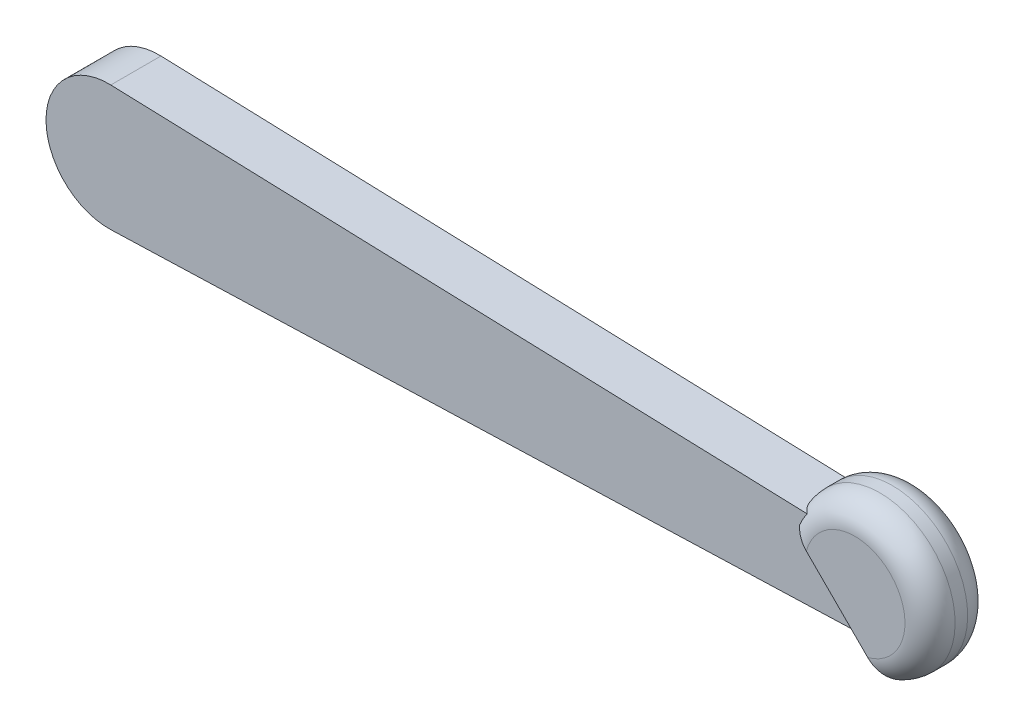
ISO-10303-21;
HEADER;
FILE_DESCRIPTION(('STEP AP214'),'2;1');
FILE_NAME('part.step','',(''),(''),'','','');
FILE_SCHEMA(('AUTOMOTIVE_DESIGN { 1 0 10303 214 1 1 1 1 }'));
ENDSEC;
DATA;
#1=APPLICATION_CONTEXT('core data for automotive mechanical design processes');
#2=APPLICATION_PROTOCOL_DEFINITION('international standard','automotive_design',2000,#1);
#3=PRODUCT_CONTEXT('',#1,'mechanical');
#4=PRODUCT('Part','Part','',(#3));
#5=PRODUCT_RELATED_PRODUCT_CATEGORY('part','',(#4));
#6=PRODUCT_DEFINITION_FORMATION('','',#4);
#7=PRODUCT_DEFINITION_CONTEXT('part definition',#1,'design');
#8=PRODUCT_DEFINITION('design','',#6,#7);
#9=PRODUCT_DEFINITION_SHAPE('','',#8);
#10=(LENGTH_UNIT() NAMED_UNIT(*) SI_UNIT(.MILLI.,.METRE.));
#11=(NAMED_UNIT(*) PLANE_ANGLE_UNIT() SI_UNIT($,.RADIAN.));
#12=(NAMED_UNIT(*) SI_UNIT($,.STERADIAN.) SOLID_ANGLE_UNIT());
#13=UNCERTAINTY_MEASURE_WITH_UNIT(LENGTH_MEASURE(1.E-05),#10,'distance_accuracy_value','');
#14=(GEOMETRIC_REPRESENTATION_CONTEXT(3) GLOBAL_UNCERTAINTY_ASSIGNED_CONTEXT((#13)) GLOBAL_UNIT_ASSIGNED_CONTEXT((#10,
#11,#12)) REPRESENTATION_CONTEXT('',''));
#15=CARTESIAN_POINT('',(0.,0.,0.));
#16=DIRECTION('',(0.,0.,1.));
#17=DIRECTION('',(1.,0.,0.));
#18=AXIS2_PLACEMENT_3D('',#15,#16,#17);
#19=CARTESIAN_POINT('',(300.,0.,10.));
#20=DIRECTION('',(0.,0.,-1.));
#21=DIRECTION('',(-1.,0.,0.));
#22=AXIS2_PLACEMENT_3D('',#19,#20,#21);
#23=CYLINDRICAL_SURFACE('',#22,15.);
#24=DIRECTION('',(0.,0.,-1.));
#25=VECTOR('',#24,1.);
#26=CARTESIAN_POINT('',(300.834626338556,-14.9767619622864,10.));
#27=LINE('',#26,#25);
#28=CARTESIAN_POINT('',(300.834626338555,-14.9767619622864,10.));
#29=VERTEX_POINT('',#28);
#30=CARTESIAN_POINT('',(300.834626338555,-14.9767619622864,-10.));
#31=VERTEX_POINT('',#30);
#32=EDGE_CURVE('E361',#29,#31,#27,.T.);
#33=ORIENTED_EDGE('',*,*,#32,.F.);
#34=CARTESIAN_POINT('',(300.,0.,10.));
#35=DIRECTION('',(0.,0.,1.));
#36=DIRECTION('',(1.,0.,0.));
#37=AXIS2_PLACEMENT_3D('',#34,#35,#36);
#38=CIRCLE('',#37,15.);
#39=CARTESIAN_POINT('',(300.5,-14.991664350565,10.));
#40=VERTEX_POINT('',#39);
#41=EDGE_CURVE('E138',#40,#29,#38,.T.);
#42=ORIENTED_EDGE('',*,*,#41,.F.);
#43=DIRECTION('',(0.,0.,-1.));
#44=VECTOR('',#43,1.);
#45=CARTESIAN_POINT('',(300.5,-14.991664350565,10.));
#46=LINE('',#45,#44);
#47=CARTESIAN_POINT('',(300.5,-14.991664350565,-10.));
#48=VERTEX_POINT('',#47);
#49=EDGE_CURVE('E133',#40,#48,#46,.T.);
#50=ORIENTED_EDGE('',*,*,#49,.T.);
#51=CARTESIAN_POINT('',(300.,0.,-10.));
#52=DIRECTION('',(0.,0.,1.));
#53=DIRECTION('',(1.,0.,0.));
#54=AXIS2_PLACEMENT_3D('',#51,#52,#53);
#55=CIRCLE('',#54,15.);
#56=EDGE_CURVE('E385',#48,#31,#55,.T.);
#57=ORIENTED_EDGE('',*,*,#56,.T.);
#58=EDGE_LOOP('',(#33,#42,#50,#57));
#59=FACE_BOUND('',#58,.T.);
#60=ADVANCED_FACE('F43',(#59),#23,.T.);
#61=CARTESIAN_POINT('',(0.833333333333332,24.9861072509416,10.));
#62=DIRECTION('',(-0.0333333333333333,-0.999444290037663,0.));
#63=DIRECTION('',(0.999444290037663,-0.0333333333333333,0.));
#64=AXIS2_PLACEMENT_3D('',#61,#62,#63);
#65=PLANE('',#64);
#66=DIRECTION('',(0.,0.,-1.));
#67=VECTOR('',#66,1.);
#68=CARTESIAN_POINT('',(274.533675654802,15.8576897543494,12.5));
#69=LINE('',#68,#67);
#70=CARTESIAN_POINT('',(274.533675654802,15.8576897543494,-2.5));
#71=VERTEX_POINT('',#70);
#72=CARTESIAN_POINT('',(274.533675654802,15.8576897543494,2.5));
#73=VERTEX_POINT('',#72);
#74=EDGE_CURVE('E372',#71,#73,#69,.F.);
#75=ORIENTED_EDGE('',*,*,#74,.F.);
#76=CARTESIAN_POINT('',(274.533675654802,15.8576897543494,-2.5));
#77=CARTESIAN_POINT('',(274.533631532428,15.857691225913,-2.75156199026018));
#78=CARTESIAN_POINT('',(274.544628529416,15.8573244555288,-3.00311115110276));
#79=CARTESIAN_POINT('',(274.588381123059,15.8558652248316,-3.50425100348619));
#80=CARTESIAN_POINT('',(274.621131643195,15.8547729338301,-3.75384213821579));
#81=CARTESIAN_POINT('',(274.70783558235,15.8518811955572,-4.24792825033985));
#82=CARTESIAN_POINT('',(274.761674735081,15.8500855592798,-4.49244333624857));
#83=CARTESIAN_POINT('',(274.889956075797,15.8458071370274,-4.97599844723954));
#84=CARTESIAN_POINT('',(274.964398547173,15.8433243416007,-5.21503839696433));
#85=CARTESIAN_POINT('',(275.133076589755,15.8376986139084,-5.68595882808112));
#86=CARTESIAN_POINT('',(275.227308239373,15.8345558124351,-5.91784071754685));
#87=CARTESIAN_POINT('',(275.434603391136,15.8276421320419,-6.37302160578955));
#88=CARTESIAN_POINT('',(275.547667864317,15.8238712207362,-6.59632016127165));
#89=CARTESIAN_POINT('',(275.791727689918,15.8157313698199,-7.03340828041223));
#90=CARTESIAN_POINT('',(275.922755730872,15.8113613399857,-7.24717954521418));
#91=CARTESIAN_POINT('',(276.201333733291,15.8020702434168,-7.66362606320901));
#92=CARTESIAN_POINT('',(276.348882599435,15.7971492132132,-7.86630205068771));
#93=CARTESIAN_POINT('',(276.649292914456,15.7871299682515,-8.24709329924922));
#94=CARTESIAN_POINT('',(276.801217412724,15.782063002546,-8.42595069107172));
#95=CARTESIAN_POINT('',(277.117282328535,15.7715216474162,-8.772524384534));
#96=CARTESIAN_POINT('',(277.281423527088,15.7660472319439,-8.94023997258218));
#97=CARTESIAN_POINT('',(277.620281736053,15.7547456779256,-9.26356947919367));
#98=CARTESIAN_POINT('',(277.794966874211,15.7489196023787,-9.4192169101643));
#99=CARTESIAN_POINT('',(278.154163270231,15.7369397318447,-9.71859908819254));
#100=CARTESIAN_POINT('',(278.338671320768,15.7307860438277,-9.86233768494725));
#101=CARTESIAN_POINT('',(278.527560372526,15.7244862412394,-10.));
#102=B_SPLINE_CURVE_WITH_KNOTS('',3,(#76,#77,#78,#79,#80,#81,#82,#83,#84,#85,#86,#87,#88,#89,
#90,#91,#92,#93,#94,#95,#96,#97,#98,#99,#100,#101),.UNSPECIFIED.,.F.,.F.,(4,2,2,2,2,2,2,2,2,2,2,
2,4),(0.,0.75442584054044,1.50867568606681,2.25889402620117,3.00912268582818,3.75920281395222,
4.50932162880698,5.26082402468816,6.01227662584126,6.71586694719617,7.41950228756928,
8.12110795436218,8.82248592511704),.UNSPECIFIED.);
#103=CARTESIAN_POINT('',(278.527560372526,15.7244862412394,-10.));
#104=VERTEX_POINT('',#103);
#105=EDGE_CURVE('E218',#71,#104,#102,.T.);
#106=ORIENTED_EDGE('',*,*,#105,.T.);
#107=DIRECTION('',(-0.999444290037663,0.0333333333333333,0.));
#108=VECTOR('',#107,1.);
#109=CARTESIAN_POINT('',(0.833333333333332,24.9861072509416,-10.));
#110=LINE('',#109,#108);
#111=CARTESIAN_POINT('',(0.833333333333332,24.9861072509416,-10.));
#112=VERTEX_POINT('',#111);
#113=EDGE_CURVE('E72',#104,#112,#110,.T.);
#114=ORIENTED_EDGE('',*,*,#113,.T.);
#115=DIRECTION('',(0.,0.,-1.));
#116=VECTOR('',#115,1.);
#117=CARTESIAN_POINT('',(0.833333333333332,24.9861072509416,10.));
#118=LINE('',#117,#116);
#119=CARTESIAN_POINT('',(0.833333333333332,24.9861072509416,10.));
#120=VERTEX_POINT('',#119);
#121=EDGE_CURVE('E158',#120,#112,#118,.T.);
#122=ORIENTED_EDGE('',*,*,#121,.F.);
#123=DIRECTION('',(-0.999444290037663,0.0333333333333333,0.));
#124=VECTOR('',#123,1.);
#125=CARTESIAN_POINT('',(0.833333333333332,24.9861072509416,10.));
#126=LINE('',#125,#124);
#127=CARTESIAN_POINT('',(278.527560372526,15.7244862412394,10.));
#128=VERTEX_POINT('',#127);
#129=EDGE_CURVE('E64',#128,#120,#126,.T.);
#130=ORIENTED_EDGE('',*,*,#129,.F.);
#131=CARTESIAN_POINT('',(278.527560372526,15.7244862412394,10.));
#132=CARTESIAN_POINT('',(278.304728547706,15.7319180986906,9.83761707608761));
#133=CARTESIAN_POINT('',(278.087989976561,15.7391467347538,9.66675086463935));
#134=CARTESIAN_POINT('',(277.668409576197,15.7531405245877,9.30848055034058));
#135=CARTESIAN_POINT('',(277.465576349573,15.7599053914458,9.12106637114451));
#136=CARTESIAN_POINT('',(277.075037368859,15.7729305957053,8.72957011128517));
#137=CARTESIAN_POINT('',(276.887393458353,15.7791888705079,8.52542609363075));
#138=CARTESIAN_POINT('',(276.530025286207,15.7911077663619,8.1020479635815));
#139=CARTESIAN_POINT('',(276.360297295203,15.7967685117947,7.88281700743047));
#140=CARTESIAN_POINT('',(276.039818952782,15.807457062943,7.42938238502525));
#141=CARTESIAN_POINT('',(275.88915681131,15.8124819266923,7.19511617844098));
#142=CARTESIAN_POINT('',(275.609450951946,15.8218106393963,6.71400724727253));
#143=CARTESIAN_POINT('',(275.480405676557,15.8261145402966,6.46716543043479));
#144=CARTESIAN_POINT('',(275.245839465286,15.8339377614475,5.96338924715558));
#145=CARTESIAN_POINT('',(275.140250399557,15.8374593539559,5.7064867288614));
#146=CARTESIAN_POINT('',(274.953491577817,15.8436881093953,5.18407790246462));
#147=CARTESIAN_POINT('',(274.872313656355,15.8463955446595,4.91857450432089));
#148=CARTESIAN_POINT('',(274.714597057459,15.8516556877366,4.29926007059726));
#149=CARTESIAN_POINT('',(274.646950272201,15.8539118343417,3.94311243362559));
#150=CARTESIAN_POINT('',(274.579094178492,15.8561749617744,3.40456720088508));
#151=CARTESIAN_POINT('',(274.562077677414,15.8567424938603,3.224124544565));
#152=CARTESIAN_POINT('',(274.539366400973,15.8574999573383,2.86247346202718));
#153=CARTESIAN_POINT('',(274.533675003635,15.8576897760671,2.68126482348085));
#154=CARTESIAN_POINT('',(274.533675654802,15.8576897543494,2.49999999999999));
#155=B_SPLINE_CURVE_WITH_KNOTS('',3,(#131,#132,#133,#134,#135,#136,#137,#138,#139,#140,#141,
#142,#143,#144,#145,#146,#147,#148,#149,#150,#151,#152,#153,#154),.UNSPECIFIED.,.F.,.F.,(4,2,2,
2,2,2,2,2,2,2,2,4),(0.,0.827366928072769,1.65524117518409,2.48633230578788,3.31725009449954,
4.15188162264444,4.98645298962917,5.81856764814941,6.65040365650442,7.73480063006316,
8.27823221679437,8.82182587262312),.UNSPECIFIED.);
#156=EDGE_CURVE('E11',#128,#73,#155,.T.);
#157=ORIENTED_EDGE('',*,*,#156,.T.);
#158=EDGE_LOOP('',(#75,#106,#114,#122,#130,#157));
#159=FACE_BOUND('',#158,.T.);
#160=ADVANCED_FACE('F228',(#159),#65,.F.);
#161=CARTESIAN_POINT('',(0.,0.,10.));
#162=DIRECTION('',(0.,0.,1.));
#163=DIRECTION('',(1.,0.,0.));
#164=AXIS2_PLACEMENT_3D('',#161,#162,#163);
#165=PLANE('',#164);
#166=DIRECTION('',(-0.707106781186552,0.707106781186543,0.));
#167=VECTOR('',#166,1.);
#168=CARTESIAN_POINT('',(142.928932188133,142.928932188134,10.));
#169=LINE('',#168,#167);
#170=CARTESIAN_POINT('',(275.488675150085,10.3691892261837,10.));
#171=VERTEX_POINT('',#170);
#172=EDGE_CURVE('E369',#29,#171,#169,.T.);
#173=ORIENTED_EDGE('',*,*,#172,.T.);
#174=CARTESIAN_POINT('',(300.,0.,10.));
#175=DIRECTION('',(0.,0.,1.));
#176=DIRECTION('',(1.,0.,0.));
#177=AXIS2_PLACEMENT_3D('',#174,#175,#176);
#178=CIRCLE('',#177,26.6143782776615);
#179=EDGE_CURVE('E58',#171,#128,#178,.F.);
#180=ORIENTED_EDGE('',*,*,#179,.T.);
#181=ORIENTED_EDGE('',*,*,#129,.T.);
#182=CARTESIAN_POINT('',(0.,0.,10.));
#183=DIRECTION('',(0.,0.,1.));
#184=DIRECTION('',(1.,0.,0.));
#185=AXIS2_PLACEMENT_3D('',#182,#183,#184);
#186=CIRCLE('',#185,25.);
#187=CARTESIAN_POINT('',(0.833333333333332,-24.9861072509416,10.));
#188=VERTEX_POINT('',#187);
#189=EDGE_CURVE('E139',#120,#188,#186,.T.);
#190=ORIENTED_EDGE('',*,*,#189,.T.);
#191=DIRECTION('',(0.999444290037663,0.0333333333333333,0.));
#192=VECTOR('',#191,1.);
#193=CARTESIAN_POINT('',(0.833333333333332,-24.9861072509416,10.));
#194=LINE('',#193,#192);
#195=EDGE_CURVE('E126',#188,#40,#194,.T.);
#196=ORIENTED_EDGE('',*,*,#195,.T.);
#197=ORIENTED_EDGE('',*,*,#41,.T.);
#198=EDGE_LOOP('',(#173,#180,#181,#190,#196,#197));
#199=FACE_BOUND('',#198,.T.);
#200=ADVANCED_FACE('F143',(#199),#165,.T.);
#201=CARTESIAN_POINT('',(0.,0.,-10.));
#202=DIRECTION('',(0.,0.,1.));
#203=DIRECTION('',(1.,0.,0.));
#204=AXIS2_PLACEMENT_3D('',#201,#202,#203);
#205=PLANE('',#204);
#206=ORIENTED_EDGE('',*,*,#113,.F.);
#207=CARTESIAN_POINT('',(300.,0.,-10.));
#208=DIRECTION('',(0.,0.,1.));
#209=DIRECTION('',(1.,0.,0.));
#210=AXIS2_PLACEMENT_3D('',#207,#208,#209);
#211=CIRCLE('',#210,26.6143782776615);
#212=CARTESIAN_POINT('',(275.488675150085,10.3691892261837,-10.));
#213=VERTEX_POINT('',#212);
#214=EDGE_CURVE('E226',#104,#213,#211,.T.);
#215=ORIENTED_EDGE('',*,*,#214,.T.);
#216=DIRECTION('',(-0.707106781186552,0.707106781186543,0.));
#217=VECTOR('',#216,1.);
#218=CARTESIAN_POINT('',(142.928932188133,142.928932188134,-10.));
#219=LINE('',#218,#217);
#220=EDGE_CURVE('E151',#31,#213,#219,.T.);
#221=ORIENTED_EDGE('',*,*,#220,.F.);
#222=ORIENTED_EDGE('',*,*,#56,.F.);
#223=DIRECTION('',(0.999444290037663,0.0333333333333333,0.));
#224=VECTOR('',#223,1.);
#225=CARTESIAN_POINT('',(0.833333333333332,-24.9861072509416,-10.));
#226=LINE('',#225,#224);
#227=CARTESIAN_POINT('',(0.833333333333332,-24.9861072509416,-10.));
#228=VERTEX_POINT('',#227);
#229=EDGE_CURVE('E382',#228,#48,#226,.T.);
#230=ORIENTED_EDGE('',*,*,#229,.F.);
#231=CARTESIAN_POINT('',(0.,0.,-10.));
#232=DIRECTION('',(0.,0.,1.));
#233=DIRECTION('',(1.,0.,0.));
#234=AXIS2_PLACEMENT_3D('',#231,#232,#233);
#235=CIRCLE('',#234,25.);
#236=EDGE_CURVE('E149',#112,#228,#235,.T.);
#237=ORIENTED_EDGE('',*,*,#236,.F.);
#238=EDGE_LOOP('',(#206,#215,#221,#222,#230,#237));
#239=FACE_BOUND('',#238,.T.);
#240=ADVANCED_FACE('F233',(#239),#205,.F.);
#241=CARTESIAN_POINT('',(0.,0.,10.));
#242=DIRECTION('',(0.,0.,-1.));
#243=DIRECTION('',(-1.,0.,0.));
#244=AXIS2_PLACEMENT_3D('',#241,#242,#243);
#245=CYLINDRICAL_SURFACE('',#244,25.);
#246=ORIENTED_EDGE('',*,*,#236,.T.);
#247=DIRECTION('',(0.,0.,-1.));
#248=VECTOR('',#247,1.);
#249=CARTESIAN_POINT('',(0.833333333333332,-24.9861072509416,10.));
#250=LINE('',#249,#248);
#251=EDGE_CURVE('E130',#188,#228,#250,.T.);
#252=ORIENTED_EDGE('',*,*,#251,.F.);
#253=ORIENTED_EDGE('',*,*,#189,.F.);
#254=ORIENTED_EDGE('',*,*,#121,.T.);
#255=EDGE_LOOP('',(#246,#252,#253,#254));
#256=FACE_BOUND('',#255,.T.);
#257=ADVANCED_FACE('F148',(#256),#245,.T.);
#258=CARTESIAN_POINT('',(0.833333333333332,-24.9861072509416,10.));
#259=DIRECTION('',(-0.0333333333333333,0.999444290037663,0.));
#260=DIRECTION('',(-0.999444290037663,-0.0333333333333333,0.));
#261=AXIS2_PLACEMENT_3D('',#258,#259,#260);
#262=PLANE('',#261);
#263=ORIENTED_EDGE('',*,*,#229,.T.);
#264=ORIENTED_EDGE('',*,*,#49,.F.);
#265=ORIENTED_EDGE('',*,*,#195,.F.);
#266=ORIENTED_EDGE('',*,*,#251,.T.);
#267=EDGE_LOOP('',(#263,#264,#265,#266));
#268=FACE_BOUND('',#267,.T.);
#269=ADVANCED_FACE('F128',(#268),#262,.F.);
#270=CARTESIAN_POINT('',(300.,0.,12.5));
#271=DIRECTION('',(0.,0.,-1.));
#272=DIRECTION('',(-1.,0.,0.));
#273=AXIS2_PLACEMENT_3D('',#270,#271,#272);
#274=CYLINDRICAL_SURFACE('',#273,30.);
#275=DIRECTION('',(0.,0.,-1.));
#276=VECTOR('',#275,1.);
#277=CARTESIAN_POINT('',(312.928932188135,-27.0710678118654,12.5));
#278=LINE('',#277,#276);
#279=CARTESIAN_POINT('',(312.928932188135,-27.0710678118654,2.5));
#280=VERTEX_POINT('',#279);
#281=CARTESIAN_POINT('',(312.928932188135,-27.0710678118654,-2.5));
#282=VERTEX_POINT('',#281);
#283=EDGE_CURVE('E355',#280,#282,#278,.T.);
#284=ORIENTED_EDGE('',*,*,#283,.T.);
#285=CARTESIAN_POINT('',(300.,0.,-2.5));
#286=DIRECTION('',(0.,0.,1.));
#287=DIRECTION('',(1.,0.,0.));
#288=AXIS2_PLACEMENT_3D('',#285,#286,#287);
#289=CIRCLE('',#288,30.);
#290=EDGE_CURVE('E164',#282,#71,#289,.T.);
#291=ORIENTED_EDGE('',*,*,#290,.T.);
#292=ORIENTED_EDGE('',*,*,#74,.T.);
#293=CARTESIAN_POINT('',(300.,0.,2.5));
#294=DIRECTION('',(0.,0.,1.));
#295=DIRECTION('',(1.,0.,0.));
#296=AXIS2_PLACEMENT_3D('',#293,#294,#295);
#297=CIRCLE('',#296,30.);
#298=EDGE_CURVE('E156',#73,#280,#297,.F.);
#299=ORIENTED_EDGE('',*,*,#298,.T.);
#300=EDGE_LOOP('',(#284,#291,#292,#299));
#301=FACE_BOUND('',#300,.T.);
#302=ADVANCED_FACE('F188',(#301),#274,.T.);
#303=CARTESIAN_POINT('',(312.928932188135,-27.0710678118654,12.5));
#304=DIRECTION('',(0.707106781186543,0.707106781186552,0.));
#305=DIRECTION('',(-0.707106781186552,0.707106781186543,0.));
#306=AXIS2_PLACEMENT_3D('',#303,#304,#305);
#307=PLANE('',#306);
#308=ORIENTED_EDGE('',*,*,#220,.T.);
#309=CARTESIAN_POINT('',(275.488675150085,10.3691892261837,-10.));
#310=CARTESIAN_POINT('',(275.65921061644,10.1986537598293,-10.1971678935174));
#311=CARTESIAN_POINT('',(275.836044905751,10.0218194705174,-10.3833318027643));
#312=CARTESIAN_POINT('',(276.200542690553,9.65732168571572,-10.7327919336394));
#313=CARTESIAN_POINT('',(276.388200375057,9.46966400121175,-10.8961002677767));
#314=CARTESIAN_POINT('',(276.772181134436,9.08568324183233,-11.1987434950698));
#315=CARTESIAN_POINT('',(276.968476344081,8.88938803218788,-11.3381492616047));
#316=CARTESIAN_POINT('',(277.368639963354,8.48922441291501,-11.5932157194472));
#317=CARTESIAN_POINT('',(277.572508974022,8.28535540224663,-11.7088745214746));
#318=CARTESIAN_POINT('',(277.98579293862,7.87207143764914,-11.916091717991));
#319=CARTESIAN_POINT('',(278.195195607551,7.66266876871817,-12.0076992508132));
#320=CARTESIAN_POINT('',(278.618462702815,7.23940167345376,-12.1672638174432));
#321=CARTESIAN_POINT('',(278.832327448133,7.02553692813557,-12.2352191542208));
#322=CARTESIAN_POINT('',(279.262881239514,6.59498313675469,-12.3477754724326));
#323=CARTESIAN_POINT('',(279.479567500398,6.37829687587052,-12.3923979242697));
#324=CARTESIAN_POINT('',(279.914596189573,5.94326818669617,-12.458925426005));
#325=CARTESIAN_POINT('',(280.132937848955,5.72492652731423,-12.4808404413576));
#326=CARTESIAN_POINT('',(280.406495665168,5.45136871110132,-12.494527570304));
#327=CARTESIAN_POINT('',(280.461513991313,5.39635038495604,-12.4965841826672));
#328=CARTESIAN_POINT('',(280.571514792139,5.28634958413011,-12.499319558106));
#329=CARTESIAN_POINT('',(280.626497250313,5.23136712595609,-12.4999996463255));
#330=CARTESIAN_POINT('',(280.681483474219,5.17638090205031,-12.5));
#331=B_SPLINE_CURVE_WITH_KNOTS('',3,(#309,#310,#311,#312,#313,#314,#315,#316,#317,#318,#319,
#320,#321,#322,#323,#324,#325,#326,#327,#328,#329,#330),.UNSPECIFIED.,.F.,.F.,(4,2,2,2,2,2,2,2,
2,2,4),(0.,0.934119634457636,1.86774233423545,2.79854699520285,3.72942568120477,
4.65838745442753,5.5874158663389,6.51558789583207,7.44335241217937,7.67685032570935,
7.91012334980268),.UNSPECIFIED.);
#332=CARTESIAN_POINT('',(280.681483474219,5.1763809020503,-12.5));
#333=VERTEX_POINT('',#332);
#334=EDGE_CURVE('E203',#213,#333,#331,.T.);
#335=ORIENTED_EDGE('',*,*,#334,.T.);
#336=DIRECTION('',(0.707106781186552,-0.707106781186543,0.));
#337=VECTOR('',#336,1.);
#338=CARTESIAN_POINT('',(312.928932188135,-27.0710678118654,-12.5));
#339=LINE('',#338,#337);
#340=CARTESIAN_POINT('',(305.176380902051,-19.3185165257813,-12.5));
#341=VERTEX_POINT('',#340);
#342=EDGE_CURVE('E357',#333,#341,#339,.T.);
#343=ORIENTED_EDGE('',*,*,#342,.T.);
#344=CARTESIAN_POINT('',(305.176380902051,-19.3185165257813,-12.5));
#345=CARTESIAN_POINT('',(305.415554823916,-19.5576904476465,-12.5000360268851));
#346=CARTESIAN_POINT('',(305.654777241904,-19.7969128656347,-12.4871274513599));
#347=CARTESIAN_POINT('',(306.131896762962,-20.2740323866932,-12.4345306294047));
#348=CARTESIAN_POINT('',(306.369792872559,-20.5119284962902,-12.3948244768771));
#349=CARTESIAN_POINT('',(306.843632744379,-20.9857683681097,-12.2874860486215));
#350=CARTESIAN_POINT('',(307.079561923355,-21.2216975470857,-12.2197223988731));
#351=CARTESIAN_POINT('',(307.429615197024,-21.5717508207552,-12.0967783401146));
#352=CARTESIAN_POINT('',(307.545652011508,-21.6877876352384,-12.0522508626622));
#353=CARTESIAN_POINT('',(307.776273506931,-21.9184091306621,-11.9560415347955));
#354=CARTESIAN_POINT('',(307.890857703928,-22.0329933276593,-11.904357365109));
#355=CARTESIAN_POINT('',(308.232974586949,-22.37511021068,-11.7380745733389));
#356=CARTESIAN_POINT('',(308.4579183347,-22.600053958431,-11.6125782506623));
#357=CARTESIAN_POINT('',(308.898639271287,-23.0407748950177,-11.3328157748254));
#358=CARTESIAN_POINT('',(309.114417182424,-23.2565528061551,-11.178551893838));
#359=CARTESIAN_POINT('',(309.534227663304,-23.6763632870351,-10.8421453951453));
#360=CARTESIAN_POINT('',(309.738284781145,-23.8804204048756,-10.6600642035482));
#361=CARTESIAN_POINT('',(310.132937077418,-24.2750727011492,-10.2687682321013));
#362=CARTESIAN_POINT('',(310.323534187537,-24.4656698112682,-10.0595573579859));
#363=CARTESIAN_POINT('',(310.669973069805,-24.8121086935354,-9.63867927273671));
#364=CARTESIAN_POINT('',(310.827364750338,-24.9695003740689,-9.42955932599238));
#365=CARTESIAN_POINT('',(311.128119466222,-25.2702550899524,-8.99204315117424));
#366=CARTESIAN_POINT('',(311.271483994568,-25.4136196182992,-8.76364897940579));
#367=CARTESIAN_POINT('',(311.5428192927,-25.6849549164311,-8.28908406786433));
#368=CARTESIAN_POINT('',(311.670783639528,-25.8129192632589,-8.04290597897643));
#369=CARTESIAN_POINT('',(311.909918048328,-26.052053672059,-7.53475110959961));
#370=CARTESIAN_POINT('',(312.021089607634,-26.1632252313643,-7.27277574059714));
#371=CARTESIAN_POINT('',(312.217262616743,-26.3593982404735,-6.75673040138265));
#372=CARTESIAN_POINT('',(312.303647564167,-26.4457831878976,-6.50371028800497));
#373=CARTESIAN_POINT('',(312.460413710841,-26.6025493345721,-5.98795256024211));
#374=CARTESIAN_POINT('',(312.530796299838,-26.6729319235683,-5.72521579201848));
#375=CARTESIAN_POINT('',(312.654809417327,-26.7969450410581,-5.19237659234003));
#376=CARTESIAN_POINT('',(312.708464168709,-26.85059979244,-4.92228543298695));
#377=CARTESIAN_POINT('',(312.798630856583,-26.9407664803139,-4.3765506487165));
#378=CARTESIAN_POINT('',(312.835150729147,-26.9772863528779,-4.10090965603762));
#379=CARTESIAN_POINT('',(312.884910827111,-27.0270464508421,-3.60422544126371));
#380=CARTESIAN_POINT('',(312.90142321942,-27.0435588431508,-3.38382630535602));
#381=CARTESIAN_POINT('',(312.923429816868,-27.065565440599,-2.94229089745144));
#382=CARTESIAN_POINT('',(312.928941872423,-27.0710774961536,-2.72115640389573));
#383=CARTESIAN_POINT('',(312.928932188135,-27.0710678118654,-2.50000000000001));
#384=B_SPLINE_CURVE_WITH_KNOTS('',3,(#344,#345,#346,#347,#348,#349,#350,#351,#352,#353,#354,
#355,#356,#357,#358,#359,#360,#361,#362,#363,#364,#365,#366,#367,#368,#369,#370,#371,#372,#373,
#374,#375,#376,#377,#378,#379,#380,#381,#382,#383),.UNSPECIFIED.,.F.,.F.,(4,2,2,2,2,2,2,2,2,2,2,
2,2,2,2,2,2,2,2,4),(0.,1.01457235552942,2.0298233187561,3.04988274999935,3.55984519183107,
4.06997328587543,5.09438022308656,6.11870628292153,7.14080227760551,8.16275128889505,
9.07777521174732,9.99270163674186,10.9080083375306,11.8232333765309,12.665088662547,
13.5068708085863,14.3474282815571,15.1875960625039,15.8519646294351,16.51525423585),.UNSPECIFIED.);
#385=EDGE_CURVE('E197',#341,#282,#384,.T.);
#386=ORIENTED_EDGE('',*,*,#385,.T.);
#387=ORIENTED_EDGE('',*,*,#283,.F.);
#388=CARTESIAN_POINT('',(312.928932188135,-27.0710678118654,2.5));
#389=CARTESIAN_POINT('',(312.928957904837,-27.0710935285677,2.76838701990259));
#390=CARTESIAN_POINT('',(312.920829777931,-27.0629654016615,3.03676590912641));
#391=CARTESIAN_POINT('',(312.888453078012,-27.0305887017431,3.57153884375151));
#392=CARTESIAN_POINT('',(312.86420655401,-27.006342177741,3.83793313708736));
#393=CARTESIAN_POINT('',(312.799844242467,-26.941979866198,4.36631185884294));
#394=CARTESIAN_POINT('',(312.759760093661,-26.9018957173917,4.62830400015684));
#395=CARTESIAN_POINT('',(312.664081437516,-26.8062170612468,5.14655857879153));
#396=CARTESIAN_POINT('',(312.608486897734,-26.7506225214647,5.40282100412609));
#397=CARTESIAN_POINT('',(312.482264172995,-26.6243997967254,5.90784257023664));
#398=CARTESIAN_POINT('',(312.411635151505,-26.5537707752354,6.15660129261983));
#399=CARTESIAN_POINT('',(312.255947759135,-26.3980833828657,6.64491956752828));
#400=CARTESIAN_POINT('',(312.170889028004,-26.3130246517348,6.88447889019873));
#401=CARTESIAN_POINT('',(311.98704334109,-26.1291789648207,7.3528585328636));
#402=CARTESIAN_POINT('',(311.888254395722,-26.0303900194531,7.58167729005058));
#403=CARTESIAN_POINT('',(311.67776792905,-25.819903552781,8.02710842646661));
#404=CARTESIAN_POINT('',(311.566070287036,-25.7082059107668,8.24372069152406));
#405=CARTESIAN_POINT('',(311.328547074298,-25.470682698029,8.66722156636036));
#406=CARTESIAN_POINT('',(311.202504172827,-25.3446397965578,8.87386632111854));
#407=CARTESIAN_POINT('',(310.938978392665,-25.0811140163956,9.27200073893172));
#408=CARTESIAN_POINT('',(310.801495408025,-24.9436310317555,9.46349026159873));
#409=CARTESIAN_POINT('',(310.516173376439,-24.6583090001697,9.83029148707291));
#410=CARTESIAN_POINT('',(310.36833570859,-24.510471332321,10.0056053370703));
#411=CARTESIAN_POINT('',(310.063379250394,-24.2055148741246,10.3392816176851));
#412=CARTESIAN_POINT('',(309.906259730877,-24.0483953546082,10.4976427137637));
#413=CARTESIAN_POINT('',(309.575476215083,-23.717611838814,10.8045542316884));
#414=CARTESIAN_POINT('',(309.401376755423,-23.5435123791536,10.9521660603379));
#415=CARTESIAN_POINT('',(309.045452149683,-23.1875877734142,11.2274027954807));
#416=CARTESIAN_POINT('',(308.863626607323,-23.0057622310536,11.3550266751872));
#417=CARTESIAN_POINT('',(308.493353426389,-22.6354890501201,11.5900991908932));
#418=CARTESIAN_POINT('',(308.304899181592,-22.4470348053229,11.6975269817669));
#419=CARTESIAN_POINT('',(307.92279371823,-22.064929341961,11.8919466170524));
#420=CARTESIAN_POINT('',(307.72914229936,-21.871277923091,11.978937672544));
#421=CARTESIAN_POINT('',(307.341689245613,-21.4838248693439,12.131058857294));
#422=CARTESIAN_POINT('',(307.147964832588,-21.2901004563188,12.1965837667896));
#423=CARTESIAN_POINT('',(306.757737453937,-20.8998730776683,12.3083157158685));
#424=CARTESIAN_POINT('',(306.561234204295,-20.7033698280263,12.3545207658568));
#425=CARTESIAN_POINT('',(306.167045826527,-20.3091814502574,12.4278717404029));
#426=CARTESIAN_POINT('',(305.969365714855,-20.1115013385853,12.4550720319437));
#427=CARTESIAN_POINT('',(305.573240380708,-19.7153760044389,12.4911419812964));
#428=CARTESIAN_POINT('',(305.374795470559,-19.5169310942894,12.5000184613211));
#429=CARTESIAN_POINT('',(305.176380902051,-19.3185165257813,12.5));
#430=B_SPLINE_CURVE_WITH_KNOTS('',3,(#388,#389,#390,#391,#392,#393,#394,#395,#396,#397,#398,
#399,#400,#401,#402,#403,#404,#405,#406,#407,#408,#409,#410,#411,#412,#413,#414,#415,#416,#417,
#418,#419,#420,#421,#422,#423,#424,#425,#426,#427,#428,#429),.UNSPECIFIED.,.F.,.F.,(4,2,2,2,2,2,
2,2,2,2,2,2,2,2,2,2,2,2,2,2,4),(0.,0.804902824666167,1.60970334768142,2.41290418874029,
3.21610670989225,4.01935393367866,4.82262121423751,5.62600501428147,6.42939632740954,
7.24718658131951,8.06498440980857,8.88267352557748,9.70042696344712,10.5607107282323,
11.4210386715655,12.2822497735511,13.1434941154521,13.9878709239261,14.832334666488,
15.6743726467364,16.5160970678154),.UNSPECIFIED.);
#431=CARTESIAN_POINT('',(305.176380902051,-19.3185165257813,12.5));
#432=VERTEX_POINT('',#431);
#433=EDGE_CURVE('E168',#280,#432,#430,.T.);
#434=ORIENTED_EDGE('',*,*,#433,.T.);
#435=DIRECTION('',(0.707106781186552,-0.707106781186543,0.));
#436=VECTOR('',#435,1.);
#437=CARTESIAN_POINT('',(312.928932188135,-27.0710678118654,12.5));
#438=LINE('',#437,#436);
#439=CARTESIAN_POINT('',(280.681483474219,5.1763809020503,12.5));
#440=VERTEX_POINT('',#439);
#441=EDGE_CURVE('E353',#440,#432,#438,.T.);
#442=ORIENTED_EDGE('',*,*,#441,.F.);
#443=CARTESIAN_POINT('',(280.681483474219,5.1763809020503,12.5));
#444=CARTESIAN_POINT('',(280.438150575681,5.41971380058806,12.5000445236388));
#445=CARTESIAN_POINT('',(280.194745158198,5.66311921807093,12.4866771950479));
#446=CARTESIAN_POINT('',(279.709341542859,6.14852283341018,12.4322044164948));
#447=CARTESIAN_POINT('',(279.467344368,6.39052000826877,12.3910808545291));
#448=CARTESIAN_POINT('',(278.993742210472,6.86412216579681,12.2818191653549));
#449=CARTESIAN_POINT('',(278.762041578844,7.09582279742454,12.2145161881826));
#450=CARTESIAN_POINT('',(278.303533666412,7.55433070985705,12.0524440737321));
#451=CARTESIAN_POINT('',(278.076725166383,7.78113920988545,11.9576818668815));
#452=CARTESIAN_POINT('',(277.642249133586,8.21561524268255,11.7465149199227));
#453=CARTESIAN_POINT('',(277.43421846046,8.42364591580883,11.6316061877447));
#454=CARTESIAN_POINT('',(277.025822256889,8.83204211938026,11.3772178192837));
#455=CARTESIAN_POINT('',(276.825456100256,9.03240827601264,11.2377401955079));
#456=CARTESIAN_POINT('',(276.428465507103,9.42939886916599,10.9302327454453));
#457=CARTESIAN_POINT('',(276.232110568782,9.62575380748683,10.7615023202483));
#458=CARTESIAN_POINT('',(275.946418172508,9.91144620376093,10.4897964001474));
#459=CARTESIAN_POINT('',(275.852621590849,10.0052427854194,10.3960809455564));
#460=CARTESIAN_POINT('',(275.668209148482,10.1896552277872,10.2025704575715));
#461=CARTESIAN_POINT('',(275.577593501791,10.2802708744775,10.1027750163363));
#462=CARTESIAN_POINT('',(275.488675150085,10.3691892261837,10.));
#463=B_SPLINE_CURVE_WITH_KNOTS('',3,(#443,#444,#445,#446,#447,#448,#449,#450,#451,#452,#453,
#454,#455,#456,#457,#458,#459,#460,#461,#462),.UNSPECIFIED.,.F.,.F.,(4,2,2,2,2,2,2,2,2,4),(0.,
1.03226882807415,2.06521190309504,3.06759781924412,4.06973096350218,5.01615363349079,
5.96249881534412,6.93582180988349,7.42290990605251,7.9100307118073),.UNSPECIFIED.);
#464=EDGE_CURVE('E176',#440,#171,#463,.T.);
#465=ORIENTED_EDGE('',*,*,#464,.T.);
#466=ORIENTED_EDGE('',*,*,#172,.F.);
#467=ORIENTED_EDGE('',*,*,#32,.T.);
#468=EDGE_LOOP('',(#308,#335,#343,#386,#387,#434,#442,#465,#466,#467));
#469=FACE_BOUND('',#468,.T.);
#470=ADVANCED_FACE('F182',(#469),#307,.F.);
#471=CARTESIAN_POINT('',(300.,0.,12.5));
#472=DIRECTION('',(0.,0.,1.));
#473=DIRECTION('',(1.,0.,0.));
#474=AXIS2_PLACEMENT_3D('',#471,#472,#473);
#475=PLANE('',#474);
#476=ORIENTED_EDGE('',*,*,#441,.T.);
#477=CARTESIAN_POINT('',(300.,0.,12.5));
#478=DIRECTION('',(0.,0.,1.));
#479=DIRECTION('',(1.,0.,0.));
#480=AXIS2_PLACEMENT_3D('',#477,#478,#479);
#481=CIRCLE('',#480,20.);
#482=EDGE_CURVE('E227',#432,#440,#481,.T.);
#483=ORIENTED_EDGE('',*,*,#482,.T.);
#484=EDGE_LOOP('',(#476,#483));
#485=FACE_BOUND('',#484,.T.);
#486=ADVANCED_FACE('F187',(#485),#475,.T.);
#487=CARTESIAN_POINT('',(300.,0.,-12.5));
#488=DIRECTION('',(0.,0.,1.));
#489=DIRECTION('',(1.,0.,0.));
#490=AXIS2_PLACEMENT_3D('',#487,#488,#489);
#491=PLANE('',#490);
#492=ORIENTED_EDGE('',*,*,#342,.F.);
#493=CARTESIAN_POINT('',(300.,0.,-12.5));
#494=DIRECTION('',(0.,0.,1.));
#495=DIRECTION('',(1.,0.,0.));
#496=AXIS2_PLACEMENT_3D('',#493,#494,#495);
#497=CIRCLE('',#496,20.);
#498=EDGE_CURVE('E397',#333,#341,#497,.F.);
#499=ORIENTED_EDGE('',*,*,#498,.T.);
#500=EDGE_LOOP('',(#492,#499));
#501=FACE_BOUND('',#500,.T.);
#502=ADVANCED_FACE('F190',(#501),#491,.F.);
#503=CARTESIAN_POINT('',(300.,0.,-2.5));
#504=DIRECTION('',(0.,0.,1.));
#505=DIRECTION('',(1.,0.,0.));
#506=AXIS2_PLACEMENT_3D('',#503,#504,#505);
#507=TOROIDAL_SURFACE('',#506,20.,10.);
#508=ORIENTED_EDGE('',*,*,#385,.F.);
#509=ORIENTED_EDGE('',*,*,#498,.F.);
#510=ORIENTED_EDGE('',*,*,#334,.F.);
#511=ORIENTED_EDGE('',*,*,#214,.F.);
#512=ORIENTED_EDGE('',*,*,#105,.F.);
#513=ORIENTED_EDGE('',*,*,#290,.F.);
#514=EDGE_LOOP('',(#508,#509,#510,#511,#512,#513));
#515=FACE_BOUND('',#514,.T.);
#516=ADVANCED_FACE('F209',(#515),#507,.T.);
#517=CARTESIAN_POINT('',(300.,0.,2.5));
#518=DIRECTION('',(0.,0.,1.));
#519=DIRECTION('',(1.,0.,0.));
#520=AXIS2_PLACEMENT_3D('',#517,#518,#519);
#521=TOROIDAL_SURFACE('',#520,20.,10.);
#522=ORIENTED_EDGE('',*,*,#433,.F.);
#523=ORIENTED_EDGE('',*,*,#298,.F.);
#524=ORIENTED_EDGE('',*,*,#156,.F.);
#525=ORIENTED_EDGE('',*,*,#179,.F.);
#526=ORIENTED_EDGE('',*,*,#464,.F.);
#527=ORIENTED_EDGE('',*,*,#482,.F.);
#528=EDGE_LOOP('',(#522,#523,#524,#525,#526,#527));
#529=FACE_BOUND('',#528,.T.);
#530=ADVANCED_FACE('F45',(#529),#521,.T.);
#531=CLOSED_SHELL('',(#60,#160,#200,#240,#257,#269,#302,#470,#486,#502,#516,#530));
#532=MANIFOLD_SOLID_BREP('B2',#531);
#533=ADVANCED_BREP_SHAPE_REPRESENTATION('',(#18,#532),#14);
#534=SHAPE_DEFINITION_REPRESENTATION(#9,#533);
ENDSEC;
END-ISO-10303-21;
